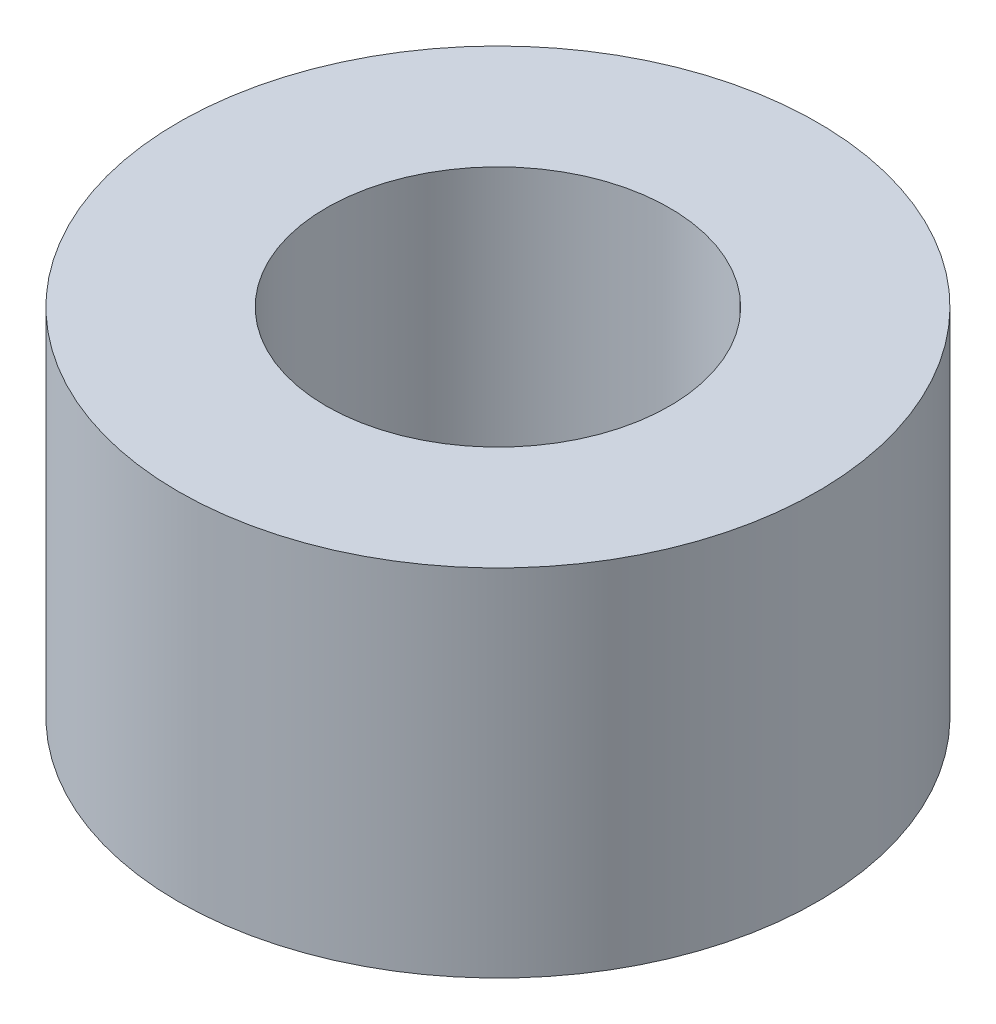
ISO-10303-21;
HEADER;
FILE_DESCRIPTION(('STEP AP214'),'2;1');
FILE_NAME('part.step','',(''),(''),'','','');
FILE_SCHEMA(('AUTOMOTIVE_DESIGN { 1 0 10303 214 1 1 1 1 }'));
ENDSEC;
DATA;
#1=APPLICATION_CONTEXT('core data for automotive mechanical design processes');
#2=APPLICATION_PROTOCOL_DEFINITION('international standard','automotive_design',2000,#1);
#3=PRODUCT_CONTEXT('',#1,'mechanical');
#4=PRODUCT('Part','Part','',(#3));
#5=PRODUCT_RELATED_PRODUCT_CATEGORY('part','',(#4));
#6=PRODUCT_DEFINITION_FORMATION('','',#4);
#7=PRODUCT_DEFINITION_CONTEXT('part definition',#1,'design');
#8=PRODUCT_DEFINITION('design','',#6,#7);
#9=PRODUCT_DEFINITION_SHAPE('','',#8);
#10=(LENGTH_UNIT() NAMED_UNIT(*) SI_UNIT(.MILLI.,.METRE.));
#11=(NAMED_UNIT(*) PLANE_ANGLE_UNIT() SI_UNIT($,.RADIAN.));
#12=(NAMED_UNIT(*) SI_UNIT($,.STERADIAN.) SOLID_ANGLE_UNIT());
#13=UNCERTAINTY_MEASURE_WITH_UNIT(LENGTH_MEASURE(1.E-05),#10,'distance_accuracy_value','');
#14=(GEOMETRIC_REPRESENTATION_CONTEXT(3) GLOBAL_UNCERTAINTY_ASSIGNED_CONTEXT((#13)) GLOBAL_UNIT_ASSIGNED_CONTEXT((#10,
#11,#12)) REPRESENTATION_CONTEXT('',''));
#15=CARTESIAN_POINT('',(0.,0.,0.));
#16=DIRECTION('',(0.,0.,1.));
#17=DIRECTION('',(1.,0.,0.));
#18=AXIS2_PLACEMENT_3D('',#15,#16,#17);
#19=CARTESIAN_POINT('',(0.,30.,0.));
#20=DIRECTION('',(0.,1.,0.));
#21=DIRECTION('',(0.,0.,1.));
#22=AXIS2_PLACEMENT_3D('',#19,#20,#21);
#23=PLANE('',#22);
#24=CARTESIAN_POINT('',(0.,30.,0.));
#25=DIRECTION('',(0.,1.,0.));
#26=DIRECTION('',(0.,0.,1.));
#27=AXIS2_PLACEMENT_3D('',#24,#25,#26);
#28=CIRCLE('',#27,27.);
#29=CARTESIAN_POINT('',(0.,30.,27.));
#30=VERTEX_POINT('',#29);
#31=EDGE_CURVE('E10',#30,#30,#28,.T.);
#32=ORIENTED_EDGE('',*,*,#31,.T.);
#33=EDGE_LOOP('',(#32));
#34=FACE_BOUND('',#33,.T.);
#35=CARTESIAN_POINT('',(0.,30.,0.));
#36=DIRECTION('',(0.,1.,0.));
#37=DIRECTION('',(0.,0.,1.));
#38=AXIS2_PLACEMENT_3D('',#35,#36,#37);
#39=CIRCLE('',#38,14.5);
#40=CARTESIAN_POINT('',(0.,30.,14.5));
#41=VERTEX_POINT('',#40);
#42=EDGE_CURVE('E54',#41,#41,#39,.T.);
#43=ORIENTED_EDGE('',*,*,#42,.F.);
#44=EDGE_LOOP('',(#43));
#45=FACE_BOUND('',#44,.T.);
#46=ADVANCED_FACE('F41',(#34,#45),#23,.T.);
#47=CARTESIAN_POINT('',(0.,0.,0.));
#48=DIRECTION('',(0.,1.,0.));
#49=DIRECTION('',(0.,0.,1.));
#50=AXIS2_PLACEMENT_3D('',#47,#48,#49);
#51=PLANE('',#50);
#52=CARTESIAN_POINT('',(0.,0.,0.));
#53=DIRECTION('',(0.,1.,0.));
#54=DIRECTION('',(0.,0.,1.));
#55=AXIS2_PLACEMENT_3D('',#52,#53,#54);
#56=CIRCLE('',#55,27.);
#57=CARTESIAN_POINT('',(0.,0.,27.));
#58=VERTEX_POINT('',#57);
#59=EDGE_CURVE('E45',#58,#58,#56,.T.);
#60=ORIENTED_EDGE('',*,*,#59,.F.);
#61=EDGE_LOOP('',(#60));
#62=FACE_BOUND('',#61,.T.);
#63=CARTESIAN_POINT('',(0.,0.,0.));
#64=DIRECTION('',(0.,1.,0.));
#65=DIRECTION('',(0.,0.,1.));
#66=AXIS2_PLACEMENT_3D('',#63,#64,#65);
#67=CIRCLE('',#66,14.5);
#68=CARTESIAN_POINT('',(0.,0.,14.5));
#69=VERTEX_POINT('',#68);
#70=EDGE_CURVE('E56',#69,#69,#67,.T.);
#71=ORIENTED_EDGE('',*,*,#70,.T.);
#72=EDGE_LOOP('',(#71));
#73=FACE_BOUND('',#72,.T.);
#74=ADVANCED_FACE('F68',(#62,#73),#51,.F.);
#75=CARTESIAN_POINT('',(0.,30.,0.));
#76=DIRECTION('',(0.,-1.,0.));
#77=DIRECTION('',(0.,0.,-1.));
#78=AXIS2_PLACEMENT_3D('',#75,#76,#77);
#79=CYLINDRICAL_SURFACE('',#78,27.);
#80=ORIENTED_EDGE('',*,*,#31,.F.);
#81=EDGE_LOOP('',(#80));
#82=FACE_BOUND('',#81,.T.);
#83=ORIENTED_EDGE('',*,*,#59,.T.);
#84=EDGE_LOOP('',(#83));
#85=FACE_BOUND('',#84,.T.);
#86=ADVANCED_FACE('F43',(#82,#85),#79,.T.);
#87=CARTESIAN_POINT('',(0.,30.,0.));
#88=DIRECTION('',(0.,-1.,0.));
#89=DIRECTION('',(0.,0.,-1.));
#90=AXIS2_PLACEMENT_3D('',#87,#88,#89);
#91=CYLINDRICAL_SURFACE('',#90,14.5);
#92=ORIENTED_EDGE('',*,*,#42,.T.);
#93=EDGE_LOOP('',(#92));
#94=FACE_BOUND('',#93,.T.);
#95=ORIENTED_EDGE('',*,*,#70,.F.);
#96=EDGE_LOOP('',(#95));
#97=FACE_BOUND('',#96,.T.);
#98=ADVANCED_FACE('F64',(#94,#97),#91,.F.);
#99=CLOSED_SHELL('',(#46,#74,#86,#98));
#100=MANIFOLD_SOLID_BREP('B2',#99);
#101=ADVANCED_BREP_SHAPE_REPRESENTATION('',(#18,#100),#14);
#102=SHAPE_DEFINITION_REPRESENTATION(#9,#101);
ENDSEC;
END-ISO-10303-21;
